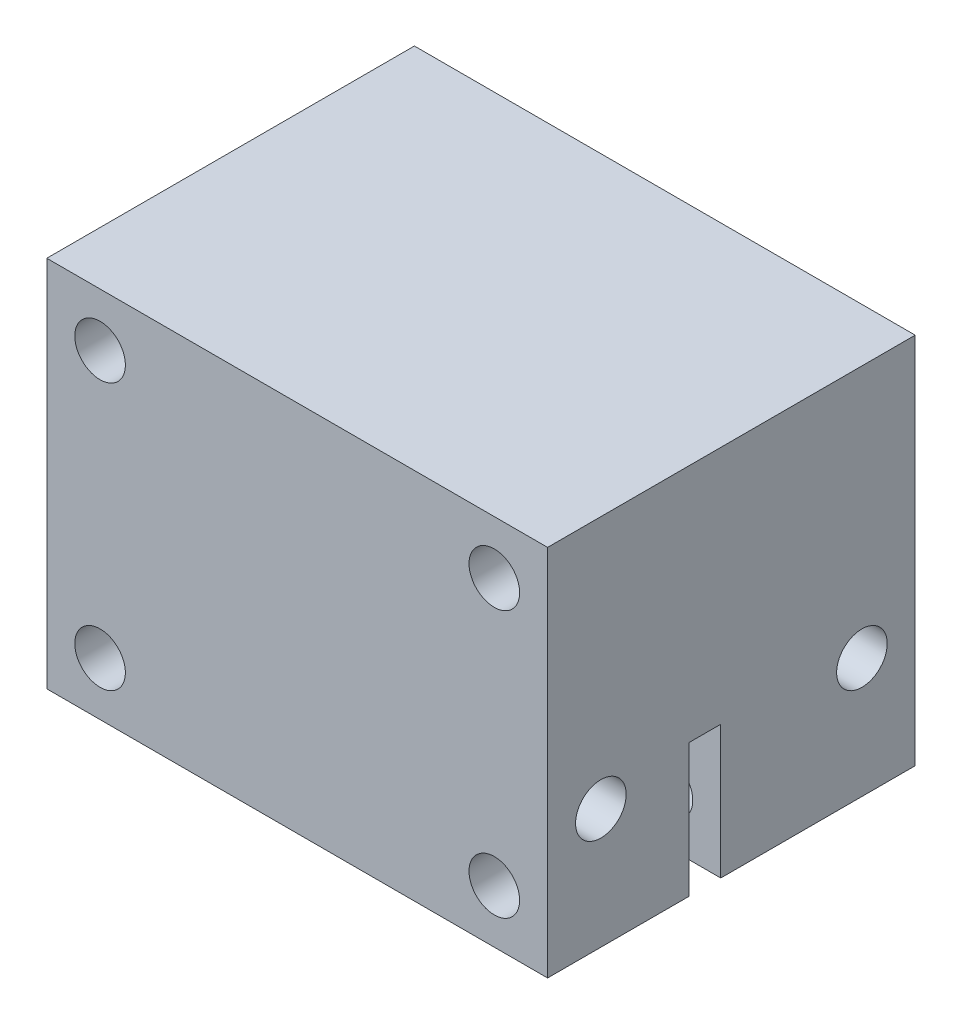
ISO-10303-21;
HEADER;
FILE_DESCRIPTION(('STEP AP214'),'2;1');
FILE_NAME('part.step','',(''),(''),'','','');
FILE_SCHEMA(('AUTOMOTIVE_DESIGN { 1 0 10303 214 1 1 1 1 }'));
ENDSEC;
DATA;
#1=APPLICATION_CONTEXT('core data for automotive mechanical design processes');
#2=APPLICATION_PROTOCOL_DEFINITION('international standard','automotive_design',2000,#1);
#3=PRODUCT_CONTEXT('',#1,'mechanical');
#4=PRODUCT('Part','Part','',(#3));
#5=PRODUCT_RELATED_PRODUCT_CATEGORY('part','',(#4));
#6=PRODUCT_DEFINITION_FORMATION('','',#4);
#7=PRODUCT_DEFINITION_CONTEXT('part definition',#1,'design');
#8=PRODUCT_DEFINITION('design','',#6,#7);
#9=PRODUCT_DEFINITION_SHAPE('','',#8);
#10=(LENGTH_UNIT() NAMED_UNIT(*) SI_UNIT(.MILLI.,.METRE.));
#11=(NAMED_UNIT(*) PLANE_ANGLE_UNIT() SI_UNIT($,.RADIAN.));
#12=(NAMED_UNIT(*) SI_UNIT($,.STERADIAN.) SOLID_ANGLE_UNIT());
#13=UNCERTAINTY_MEASURE_WITH_UNIT(LENGTH_MEASURE(1.E-05),#10,'distance_accuracy_value','');
#14=(GEOMETRIC_REPRESENTATION_CONTEXT(3) GLOBAL_UNCERTAINTY_ASSIGNED_CONTEXT((#13)) GLOBAL_UNIT_ASSIGNED_CONTEXT((#10,
#11,#12)) REPRESENTATION_CONTEXT('',''));
#15=CARTESIAN_POINT('',(0.,0.,0.));
#16=DIRECTION('',(0.,0.,1.));
#17=DIRECTION('',(1.,0.,0.));
#18=AXIS2_PLACEMENT_3D('',#15,#16,#17);
#19=CARTESIAN_POINT('',(0.,0.,27.6));
#20=DIRECTION('',(0.,1.,0.));
#21=DIRECTION('',(-1.,0.,0.));
#22=AXIS2_PLACEMENT_3D('',#19,#20,#21);
#23=PLANE('',#22);
#24=DIRECTION('',(0.,0.,-1.));
#25=VECTOR('',#24,1.);
#26=CARTESIAN_POINT('',(0.,0.,27.6));
#27=LINE('',#26,#25);
#28=CARTESIAN_POINT('',(0.,0.,27.6));
#29=VERTEX_POINT('',#28);
#30=CARTESIAN_POINT('',(0.,0.,17.));
#31=VERTEX_POINT('',#30);
#32=EDGE_CURVE('E11',#29,#31,#27,.T.);
#33=ORIENTED_EDGE('',*,*,#32,.T.);
#34=DIRECTION('',(1.,0.,0.));
#35=VECTOR('',#34,1.);
#36=CARTESIAN_POINT('',(0.,0.,17.));
#37=LINE('',#36,#35);
#38=CARTESIAN_POINT('',(37.6,0.,17.));
#39=VERTEX_POINT('',#38);
#40=EDGE_CURVE('E116',#31,#39,#37,.T.);
#41=ORIENTED_EDGE('',*,*,#40,.T.);
#42=DIRECTION('',(0.,0.,-1.));
#43=VECTOR('',#42,1.);
#44=CARTESIAN_POINT('',(37.6,0.,27.6));
#45=LINE('',#44,#43);
#46=CARTESIAN_POINT('',(37.6,0.,27.6));
#47=VERTEX_POINT('',#46);
#48=EDGE_CURVE('E165',#47,#39,#45,.T.);
#49=ORIENTED_EDGE('',*,*,#48,.F.);
#50=DIRECTION('',(1.,0.,0.));
#51=VECTOR('',#50,1.);
#52=CARTESIAN_POINT('',(0.,0.,27.6));
#53=LINE('',#52,#51);
#54=EDGE_CURVE('E93',#29,#47,#53,.T.);
#55=ORIENTED_EDGE('',*,*,#54,.F.);
#56=EDGE_LOOP('',(#33,#41,#49,#55));
#57=FACE_BOUND('',#56,.T.);
#58=ADVANCED_FACE('F39',(#57),#23,.F.);
#59=CARTESIAN_POINT('',(33.6,4.,27.6));
#60=DIRECTION('',(0.,0.,-1.));
#61=DIRECTION('',(-1.,0.,0.));
#62=AXIS2_PLACEMENT_3D('',#59,#60,#61);
#63=CYLINDRICAL_SURFACE('',#62,1.9);
#64=CARTESIAN_POINT('',(33.6,4.,17.));
#65=DIRECTION('',(0.,0.,1.));
#66=DIRECTION('',(1.,0.,0.));
#67=AXIS2_PLACEMENT_3D('',#64,#65,#66);
#68=CIRCLE('',#67,1.9);
#69=CARTESIAN_POINT('',(31.7,4.,17.));
#70=VERTEX_POINT('',#69);
#71=EDGE_CURVE('E204',#70,#70,#68,.T.);
#72=CARTESIAN_POINT('',(33.6,4.,27.6));
#73=DIRECTION('',(0.,0.,1.));
#74=DIRECTION('',(1.,0.,0.));
#75=AXIS2_PLACEMENT_3D('',#72,#73,#74);
#76=CIRCLE('',#75,1.9);
#77=CARTESIAN_POINT('',(31.7,4.,27.6));
#78=VERTEX_POINT('',#77);
#79=EDGE_CURVE('E214',#78,#78,#76,.T.);
#80=CARTESIAN_POINT('',(31.7,4.,17.));
#81=CARTESIAN_POINT('',(31.7,4.,17.1104166666667));
#82=CARTESIAN_POINT('',(31.7,4.,17.2208333333333));
#83=CARTESIAN_POINT('',(31.7,4.,17.4416666666667));
#84=CARTESIAN_POINT('',(31.7,4.,17.5520833333333));
#85=CARTESIAN_POINT('',(31.7,4.,17.7729166666667));
#86=CARTESIAN_POINT('',(31.7,4.,17.8833333333333));
#87=CARTESIAN_POINT('',(31.7,4.,18.1041666666667));
#88=CARTESIAN_POINT('',(31.7,4.,18.2145833333333));
#89=CARTESIAN_POINT('',(31.7,4.,18.4354166666667));
#90=CARTESIAN_POINT('',(31.7,4.,18.5458333333333));
#91=CARTESIAN_POINT('',(31.7,4.,18.7666666666667));
#92=CARTESIAN_POINT('',(31.7,4.,18.8770833333333));
#93=CARTESIAN_POINT('',(31.7,4.,19.0979166666667));
#94=CARTESIAN_POINT('',(31.7,4.,19.2083333333333));
#95=CARTESIAN_POINT('',(31.7,4.,19.4291666666667));
#96=CARTESIAN_POINT('',(31.7,4.,19.5395833333333));
#97=CARTESIAN_POINT('',(31.7,4.,19.7604166666667));
#98=CARTESIAN_POINT('',(31.7,4.,19.8708333333333));
#99=CARTESIAN_POINT('',(31.7,4.,20.0916666666667));
#100=CARTESIAN_POINT('',(31.7,4.,20.2020833333333));
#101=CARTESIAN_POINT('',(31.7,4.,20.4229166666667));
#102=CARTESIAN_POINT('',(31.7,4.,20.5333333333333));
#103=CARTESIAN_POINT('',(31.7,4.,20.7541666666667));
#104=CARTESIAN_POINT('',(31.7,4.,20.8645833333333));
#105=CARTESIAN_POINT('',(31.7,4.,21.0854166666667));
#106=CARTESIAN_POINT('',(31.7,4.,21.1958333333333));
#107=CARTESIAN_POINT('',(31.7,4.,21.4166666666667));
#108=CARTESIAN_POINT('',(31.7,4.,21.5270833333333));
#109=CARTESIAN_POINT('',(31.7,4.,21.7479166666667));
#110=CARTESIAN_POINT('',(31.7,4.,21.8583333333333));
#111=CARTESIAN_POINT('',(31.7,4.,22.0791666666667));
#112=CARTESIAN_POINT('',(31.7,4.,22.1895833333333));
#113=CARTESIAN_POINT('',(31.7,4.,22.4104166666667));
#114=CARTESIAN_POINT('',(31.7,4.,22.5208333333333));
#115=CARTESIAN_POINT('',(31.7,4.,22.7416666666667));
#116=CARTESIAN_POINT('',(31.7,4.,22.8520833333333));
#117=CARTESIAN_POINT('',(31.7,4.,23.0729166666667));
#118=CARTESIAN_POINT('',(31.7,4.,23.1833333333333));
#119=CARTESIAN_POINT('',(31.7,4.,23.4041666666667));
#120=CARTESIAN_POINT('',(31.7,4.,23.5145833333333));
#121=CARTESIAN_POINT('',(31.7,4.,23.7354166666667));
#122=CARTESIAN_POINT('',(31.7,4.,23.8458333333333));
#123=CARTESIAN_POINT('',(31.7,4.,24.0666666666667));
#124=CARTESIAN_POINT('',(31.7,4.,24.1770833333333));
#125=CARTESIAN_POINT('',(31.7,4.,24.3979166666667));
#126=CARTESIAN_POINT('',(31.7,4.,24.5083333333333));
#127=CARTESIAN_POINT('',(31.7,4.,24.7291666666667));
#128=CARTESIAN_POINT('',(31.7,4.,24.8395833333333));
#129=CARTESIAN_POINT('',(31.7,4.,25.0604166666667));
#130=CARTESIAN_POINT('',(31.7,4.,25.1708333333333));
#131=CARTESIAN_POINT('',(31.7,4.,25.3916666666667));
#132=CARTESIAN_POINT('',(31.7,4.,25.5020833333333));
#133=CARTESIAN_POINT('',(31.7,4.,25.7229166666667));
#134=CARTESIAN_POINT('',(31.7,4.,25.8333333333333));
#135=CARTESIAN_POINT('',(31.7,4.,26.0541666666667));
#136=CARTESIAN_POINT('',(31.7,4.,26.1645833333333));
#137=CARTESIAN_POINT('',(31.7,4.,26.3854166666667));
#138=CARTESIAN_POINT('',(31.7,4.,26.4958333333333));
#139=CARTESIAN_POINT('',(31.7,4.,26.7166666666667));
#140=CARTESIAN_POINT('',(31.7,4.,26.8270833333333));
#141=CARTESIAN_POINT('',(31.7,4.,27.0479166666667));
#142=CARTESIAN_POINT('',(31.7,4.,27.1583333333333));
#143=CARTESIAN_POINT('',(31.7,4.,27.3791666666667));
#144=CARTESIAN_POINT('',(31.7,4.,27.4895833333333));
#145=CARTESIAN_POINT('',(31.7,4.,27.6));
#146=B_SPLINE_CURVE_WITH_KNOTS('',3,(#80,#81,#82,#83,#84,#85,#86,#87,#88,#89,#90,#91,#92,#93,
#94,#95,#96,#97,#98,#99,#100,#101,#102,#103,#104,#105,#106,#107,#108,#109,#110,#111,#112,#113,
#114,#115,#116,#117,#118,#119,#120,#121,#122,#123,#124,#125,#126,#127,#128,#129,#130,#131,#132,
#133,#134,#135,#136,#137,#138,#139,#140,#141,#142,#143,#144,#145),.UNSPECIFIED.,.F.,.F.,(4,2,2,
2,2,2,2,2,2,2,2,2,2,2,2,2,2,2,2,2,2,2,2,2,2,2,2,2,2,2,2,2,4),(0.,0.331249999999998,
0.662499999999996,0.993749999999998,1.325,1.65625,1.9875,2.31875,2.65,2.98125,3.3125,3.64375,
3.975,4.30625,4.6375,4.96875,5.3,5.63125,5.9625,6.29375,6.625,6.95625,7.2875,7.61875,7.95,
8.28125,8.6125,8.94375,9.275,9.60625,9.9375,10.26875,10.6),.UNSPECIFIED.);
#147=EDGE_CURVE('BSEAM135',#70,#78,#146,.T.);
#148=ORIENTED_EDGE('',*,*,#71,.F.);
#149=ORIENTED_EDGE('',*,*,#79,.T.);
#150=ORIENTED_EDGE('',*,*,#147,.T.);
#151=ORIENTED_EDGE('',*,*,#147,.F.);
#152=EDGE_LOOP('',(#148,#150,#149,#151));
#153=FACE_BOUND('',#152,.T.);
#154=ADVANCED_FACE('F135',(#153),#63,.F.);
#155=CARTESIAN_POINT('',(3.99999999999998,4.,27.6));
#156=DIRECTION('',(0.,0.,-1.));
#157=DIRECTION('',(-1.,0.,0.));
#158=AXIS2_PLACEMENT_3D('',#155,#156,#157);
#159=CYLINDRICAL_SURFACE('',#158,1.9);
#160=CARTESIAN_POINT('',(3.99999999999998,4.,17.));
#161=DIRECTION('',(0.,0.,1.));
#162=DIRECTION('',(1.,0.,0.));
#163=AXIS2_PLACEMENT_3D('',#160,#161,#162);
#164=CIRCLE('',#163,1.9);
#165=CARTESIAN_POINT('',(2.09999999999998,4.,17.));
#166=VERTEX_POINT('',#165);
#167=EDGE_CURVE('E43',#166,#166,#164,.T.);
#168=CARTESIAN_POINT('',(3.99999999999998,4.,27.6));
#169=DIRECTION('',(0.,0.,1.));
#170=DIRECTION('',(1.,0.,0.));
#171=AXIS2_PLACEMENT_3D('',#168,#169,#170);
#172=CIRCLE('',#171,1.9);
#173=CARTESIAN_POINT('',(2.09999999999998,4.,27.6));
#174=VERTEX_POINT('',#173);
#175=EDGE_CURVE('E208',#174,#174,#172,.T.);
#176=CARTESIAN_POINT('',(2.09999999999998,4.,17.));
#177=CARTESIAN_POINT('',(2.09999999999998,4.,17.1104166666667));
#178=CARTESIAN_POINT('',(2.09999999999998,4.,17.2208333333333));
#179=CARTESIAN_POINT('',(2.09999999999998,4.,17.4416666666667));
#180=CARTESIAN_POINT('',(2.09999999999998,4.,17.5520833333333));
#181=CARTESIAN_POINT('',(2.09999999999998,4.,17.7729166666667));
#182=CARTESIAN_POINT('',(2.09999999999998,4.,17.8833333333333));
#183=CARTESIAN_POINT('',(2.09999999999998,4.,18.1041666666667));
#184=CARTESIAN_POINT('',(2.09999999999998,4.,18.2145833333333));
#185=CARTESIAN_POINT('',(2.09999999999998,4.,18.4354166666667));
#186=CARTESIAN_POINT('',(2.09999999999998,4.,18.5458333333333));
#187=CARTESIAN_POINT('',(2.09999999999998,4.,18.7666666666667));
#188=CARTESIAN_POINT('',(2.09999999999998,4.,18.8770833333333));
#189=CARTESIAN_POINT('',(2.09999999999998,4.,19.0979166666667));
#190=CARTESIAN_POINT('',(2.09999999999998,4.,19.2083333333333));
#191=CARTESIAN_POINT('',(2.09999999999998,4.,19.4291666666667));
#192=CARTESIAN_POINT('',(2.09999999999998,4.,19.5395833333333));
#193=CARTESIAN_POINT('',(2.09999999999998,4.,19.7604166666667));
#194=CARTESIAN_POINT('',(2.09999999999998,4.,19.8708333333333));
#195=CARTESIAN_POINT('',(2.09999999999998,4.,20.0916666666667));
#196=CARTESIAN_POINT('',(2.09999999999998,4.,20.2020833333333));
#197=CARTESIAN_POINT('',(2.09999999999998,4.,20.4229166666667));
#198=CARTESIAN_POINT('',(2.09999999999998,4.,20.5333333333333));
#199=CARTESIAN_POINT('',(2.09999999999998,4.,20.7541666666667));
#200=CARTESIAN_POINT('',(2.09999999999998,4.,20.8645833333333));
#201=CARTESIAN_POINT('',(2.09999999999998,4.,21.0854166666667));
#202=CARTESIAN_POINT('',(2.09999999999998,4.,21.1958333333333));
#203=CARTESIAN_POINT('',(2.09999999999998,4.,21.4166666666667));
#204=CARTESIAN_POINT('',(2.09999999999998,4.,21.5270833333333));
#205=CARTESIAN_POINT('',(2.09999999999998,4.,21.7479166666667));
#206=CARTESIAN_POINT('',(2.09999999999998,4.,21.8583333333333));
#207=CARTESIAN_POINT('',(2.09999999999998,4.,22.0791666666667));
#208=CARTESIAN_POINT('',(2.09999999999998,4.,22.1895833333333));
#209=CARTESIAN_POINT('',(2.09999999999998,4.,22.4104166666667));
#210=CARTESIAN_POINT('',(2.09999999999998,4.,22.5208333333333));
#211=CARTESIAN_POINT('',(2.09999999999998,4.,22.7416666666667));
#212=CARTESIAN_POINT('',(2.09999999999998,4.,22.8520833333333));
#213=CARTESIAN_POINT('',(2.09999999999998,4.,23.0729166666667));
#214=CARTESIAN_POINT('',(2.09999999999998,4.,23.1833333333333));
#215=CARTESIAN_POINT('',(2.09999999999998,4.,23.4041666666667));
#216=CARTESIAN_POINT('',(2.09999999999998,4.,23.5145833333333));
#217=CARTESIAN_POINT('',(2.09999999999998,4.,23.7354166666667));
#218=CARTESIAN_POINT('',(2.09999999999998,4.,23.8458333333333));
#219=CARTESIAN_POINT('',(2.09999999999998,4.,24.0666666666667));
#220=CARTESIAN_POINT('',(2.09999999999998,4.,24.1770833333333));
#221=CARTESIAN_POINT('',(2.09999999999998,4.,24.3979166666667));
#222=CARTESIAN_POINT('',(2.09999999999998,4.,24.5083333333333));
#223=CARTESIAN_POINT('',(2.09999999999998,4.,24.7291666666667));
#224=CARTESIAN_POINT('',(2.09999999999998,4.,24.8395833333333));
#225=CARTESIAN_POINT('',(2.09999999999998,4.,25.0604166666667));
#226=CARTESIAN_POINT('',(2.09999999999998,4.,25.1708333333333));
#227=CARTESIAN_POINT('',(2.09999999999998,4.,25.3916666666667));
#228=CARTESIAN_POINT('',(2.09999999999998,4.,25.5020833333333));
#229=CARTESIAN_POINT('',(2.09999999999998,4.,25.7229166666667));
#230=CARTESIAN_POINT('',(2.09999999999998,4.,25.8333333333333));
#231=CARTESIAN_POINT('',(2.09999999999998,4.,26.0541666666667));
#232=CARTESIAN_POINT('',(2.09999999999998,4.,26.1645833333333));
#233=CARTESIAN_POINT('',(2.09999999999998,4.,26.3854166666667));
#234=CARTESIAN_POINT('',(2.09999999999998,4.,26.4958333333333));
#235=CARTESIAN_POINT('',(2.09999999999998,4.,26.7166666666667));
#236=CARTESIAN_POINT('',(2.09999999999998,4.,26.8270833333333));
#237=CARTESIAN_POINT('',(2.09999999999998,4.,27.0479166666667));
#238=CARTESIAN_POINT('',(2.09999999999998,4.,27.1583333333333));
#239=CARTESIAN_POINT('',(2.09999999999998,4.,27.3791666666667));
#240=CARTESIAN_POINT('',(2.09999999999998,4.,27.4895833333333));
#241=CARTESIAN_POINT('',(2.09999999999998,4.,27.6));
#242=B_SPLINE_CURVE_WITH_KNOTS('',3,(#176,#177,#178,#179,#180,#181,#182,#183,#184,#185,#186,
#187,#188,#189,#190,#191,#192,#193,#194,#195,#196,#197,#198,#199,#200,#201,#202,#203,#204,#205,
#206,#207,#208,#209,#210,#211,#212,#213,#214,#215,#216,#217,#218,#219,#220,#221,#222,#223,#224,
#225,#226,#227,#228,#229,#230,#231,#232,#233,#234,#235,#236,#237,#238,#239,#240,#241),
.UNSPECIFIED.,.F.,.F.,(4,2,2,2,2,2,2,2,2,2,2,2,2,2,2,2,2,2,2,2,2,2,2,2,2,2,2,2,2,2,2,2,4),(0.,
0.331249999999998,0.662499999999996,0.993749999999998,1.325,1.65625,1.9875,2.31875,2.65,2.98125,
3.3125,3.64375,3.975,4.30625,4.6375,4.96875,5.3,5.63125,5.9625,6.29375,6.625,6.95625,7.2875,
7.61875,7.95,8.28125,8.6125,8.94375,9.275,9.60625,9.9375,10.26875,10.6),.UNSPECIFIED.);
#243=EDGE_CURVE('BSEAM141',#166,#174,#242,.T.);
#244=ORIENTED_EDGE('',*,*,#167,.F.);
#245=ORIENTED_EDGE('',*,*,#175,.T.);
#246=ORIENTED_EDGE('',*,*,#243,.T.);
#247=ORIENTED_EDGE('',*,*,#243,.F.);
#248=EDGE_LOOP('',(#244,#246,#245,#247));
#249=FACE_BOUND('',#248,.T.);
#250=ADVANCED_FACE('F141',(#249),#159,.F.);
#251=CARTESIAN_POINT('',(0.,0.,27.6));
#252=DIRECTION('',(0.,0.,-1.));
#253=DIRECTION('',(-1.,0.,0.));
#254=AXIS2_PLACEMENT_3D('',#251,#252,#253);
#255=PLANE('',#254);
#256=DIRECTION('',(0.,-1.,0.));
#257=VECTOR('',#256,1.);
#258=CARTESIAN_POINT('',(0.,0.,27.6));
#259=LINE('',#258,#257);
#260=CARTESIAN_POINT('',(0.,28.,27.6));
#261=VERTEX_POINT('',#260);
#262=EDGE_CURVE('E232',#261,#29,#259,.T.);
#263=ORIENTED_EDGE('',*,*,#262,.T.);
#264=ORIENTED_EDGE('',*,*,#54,.T.);
#265=DIRECTION('',(0.,1.,0.));
#266=VECTOR('',#265,1.);
#267=CARTESIAN_POINT('',(37.6,0.,27.6));
#268=LINE('',#267,#266);
#269=CARTESIAN_POINT('',(37.6,28.,27.6));
#270=VERTEX_POINT('',#269);
#271=EDGE_CURVE('E235',#47,#270,#268,.T.);
#272=ORIENTED_EDGE('',*,*,#271,.T.);
#273=DIRECTION('',(-1.,0.,0.));
#274=VECTOR('',#273,1.);
#275=CARTESIAN_POINT('',(0.,28.,27.6));
#276=LINE('',#275,#274);
#277=EDGE_CURVE('E65',#270,#261,#276,.T.);
#278=ORIENTED_EDGE('',*,*,#277,.T.);
#279=EDGE_LOOP('',(#263,#264,#272,#278));
#280=FACE_BOUND('',#279,.T.);
#281=CARTESIAN_POINT('',(3.99999999999998,24.,27.6));
#282=DIRECTION('',(0.,0.,1.));
#283=DIRECTION('',(1.,0.,0.));
#284=AXIS2_PLACEMENT_3D('',#281,#282,#283);
#285=CIRCLE('',#284,1.9);
#286=CARTESIAN_POINT('',(2.09999999999998,24.,27.6));
#287=VERTEX_POINT('',#286);
#288=EDGE_CURVE('E226',#287,#287,#285,.T.);
#289=ORIENTED_EDGE('',*,*,#288,.F.);
#290=EDGE_LOOP('',(#289));
#291=FACE_BOUND('',#290,.T.);
#292=CARTESIAN_POINT('',(33.6,24.,27.6));
#293=DIRECTION('',(0.,0.,1.));
#294=DIRECTION('',(1.,0.,0.));
#295=AXIS2_PLACEMENT_3D('',#292,#293,#294);
#296=CIRCLE('',#295,1.9);
#297=CARTESIAN_POINT('',(31.7,24.,27.6));
#298=VERTEX_POINT('',#297);
#299=EDGE_CURVE('E220',#298,#298,#296,.T.);
#300=ORIENTED_EDGE('',*,*,#299,.F.);
#301=EDGE_LOOP('',(#300));
#302=FACE_BOUND('',#301,.T.);
#303=ORIENTED_EDGE('',*,*,#79,.F.);
#304=EDGE_LOOP('',(#303));
#305=FACE_BOUND('',#304,.T.);
#306=ORIENTED_EDGE('',*,*,#175,.F.);
#307=EDGE_LOOP('',(#306));
#308=FACE_BOUND('',#307,.T.);
#309=ADVANCED_FACE('F260',(#280,#291,#302,#305,#308),#255,.F.);
#310=CARTESIAN_POINT('',(0.,0.,0.));
#311=DIRECTION('',(0.,0.,-1.));
#312=DIRECTION('',(-1.,0.,0.));
#313=AXIS2_PLACEMENT_3D('',#310,#311,#312);
#314=PLANE('',#313);
#315=CARTESIAN_POINT('',(33.6,4.,0.));
#316=DIRECTION('',(0.,0.,1.));
#317=DIRECTION('',(1.,0.,0.));
#318=AXIS2_PLACEMENT_3D('',#315,#316,#317);
#319=CIRCLE('',#318,1.9);
#320=CARTESIAN_POINT('',(31.7,4.,0.));
#321=VERTEX_POINT('',#320);
#322=EDGE_CURVE('E211',#321,#321,#319,.T.);
#323=ORIENTED_EDGE('',*,*,#322,.T.);
#324=EDGE_LOOP('',(#323));
#325=FACE_BOUND('',#324,.T.);
#326=CARTESIAN_POINT('',(3.99999999999998,24.,0.));
#327=DIRECTION('',(0.,0.,1.));
#328=DIRECTION('',(1.,0.,0.));
#329=AXIS2_PLACEMENT_3D('',#326,#327,#328);
#330=CIRCLE('',#329,1.9);
#331=CARTESIAN_POINT('',(2.09999999999998,24.,0.));
#332=VERTEX_POINT('',#331);
#333=EDGE_CURVE('E223',#332,#332,#330,.T.);
#334=ORIENTED_EDGE('',*,*,#333,.T.);
#335=EDGE_LOOP('',(#334));
#336=FACE_BOUND('',#335,.T.);
#337=DIRECTION('',(0.,-1.,0.));
#338=VECTOR('',#337,1.);
#339=CARTESIAN_POINT('',(0.,0.,0.));
#340=LINE('',#339,#338);
#341=CARTESIAN_POINT('',(0.,28.,0.));
#342=VERTEX_POINT('',#341);
#343=CARTESIAN_POINT('',(0.,0.,0.));
#344=VERTEX_POINT('',#343);
#345=EDGE_CURVE('E229',#342,#344,#340,.T.);
#346=ORIENTED_EDGE('',*,*,#345,.F.);
#347=DIRECTION('',(-1.,0.,0.));
#348=VECTOR('',#347,1.);
#349=CARTESIAN_POINT('',(0.,28.,0.));
#350=LINE('',#349,#348);
#351=CARTESIAN_POINT('',(37.6,28.,0.));
#352=VERTEX_POINT('',#351);
#353=EDGE_CURVE('E86',#352,#342,#350,.T.);
#354=ORIENTED_EDGE('',*,*,#353,.F.);
#355=DIRECTION('',(0.,1.,0.));
#356=VECTOR('',#355,1.);
#357=CARTESIAN_POINT('',(37.6,0.,0.));
#358=LINE('',#357,#356);
#359=CARTESIAN_POINT('',(37.6,0.,0.));
#360=VERTEX_POINT('',#359);
#361=EDGE_CURVE('E241',#360,#352,#358,.T.);
#362=ORIENTED_EDGE('',*,*,#361,.F.);
#363=DIRECTION('',(1.,0.,0.));
#364=VECTOR('',#363,1.);
#365=CARTESIAN_POINT('',(0.,0.,0.));
#366=LINE('',#365,#364);
#367=EDGE_CURVE('E162',#344,#360,#366,.T.);
#368=ORIENTED_EDGE('',*,*,#367,.F.);
#369=EDGE_LOOP('',(#346,#354,#362,#368));
#370=FACE_BOUND('',#369,.T.);
#371=CARTESIAN_POINT('',(33.6,24.,0.));
#372=DIRECTION('',(0.,0.,1.));
#373=DIRECTION('',(1.,0.,0.));
#374=AXIS2_PLACEMENT_3D('',#371,#372,#373);
#375=CIRCLE('',#374,1.9);
#376=CARTESIAN_POINT('',(31.7,24.,0.));
#377=VERTEX_POINT('',#376);
#378=EDGE_CURVE('E217',#377,#377,#375,.T.);
#379=ORIENTED_EDGE('',*,*,#378,.T.);
#380=EDGE_LOOP('',(#379));
#381=FACE_BOUND('',#380,.T.);
#382=CARTESIAN_POINT('',(3.99999999999998,4.,0.));
#383=DIRECTION('',(0.,0.,1.));
#384=DIRECTION('',(1.,0.,0.));
#385=AXIS2_PLACEMENT_3D('',#382,#383,#384);
#386=CIRCLE('',#385,1.9);
#387=CARTESIAN_POINT('',(2.09999999999998,4.,0.));
#388=VERTEX_POINT('',#387);
#389=EDGE_CURVE('E207',#388,#388,#386,.T.);
#390=ORIENTED_EDGE('',*,*,#389,.T.);
#391=EDGE_LOOP('',(#390));
#392=FACE_BOUND('',#391,.T.);
#393=ADVANCED_FACE('F155',(#325,#336,#370,#381,#392),#314,.T.);
#394=CARTESIAN_POINT('',(0.,0.,27.6));
#395=DIRECTION('',(1.,0.,0.));
#396=DIRECTION('',(0.,1.,0.));
#397=AXIS2_PLACEMENT_3D('',#394,#395,#396);
#398=PLANE('',#397);
#399=CARTESIAN_POINT('',(0.,9.,23.6));
#400=DIRECTION('',(1.,0.,0.));
#401=DIRECTION('',(0.,1.,0.));
#402=AXIS2_PLACEMENT_3D('',#399,#400,#401);
#403=CIRCLE('',#402,1.9);
#404=CARTESIAN_POINT('',(0.,10.9,23.6));
#405=VERTEX_POINT('',#404);
#406=EDGE_CURVE('E174',#405,#405,#403,.T.);
#407=ORIENTED_EDGE('',*,*,#406,.T.);
#408=EDGE_LOOP('',(#407));
#409=FACE_BOUND('',#408,.T.);
#410=CARTESIAN_POINT('',(0.,9.,4.));
#411=DIRECTION('',(1.,0.,0.));
#412=DIRECTION('',(0.,1.,0.));
#413=AXIS2_PLACEMENT_3D('',#410,#411,#412);
#414=CIRCLE('',#413,1.9);
#415=CARTESIAN_POINT('',(0.,10.9,4.));
#416=VERTEX_POINT('',#415);
#417=EDGE_CURVE('E184',#416,#416,#414,.T.);
#418=ORIENTED_EDGE('',*,*,#417,.T.);
#419=EDGE_LOOP('',(#418));
#420=FACE_BOUND('',#419,.T.);
#421=DIRECTION('',(0.,0.,1.));
#422=VECTOR('',#421,1.);
#423=CARTESIAN_POINT('',(0.,10.,17.));
#424=LINE('',#423,#422);
#425=CARTESIAN_POINT('',(0.,10.,14.6));
#426=VERTEX_POINT('',#425);
#427=CARTESIAN_POINT('',(0.,10.,17.));
#428=VERTEX_POINT('',#427);
#429=EDGE_CURVE('E124',#426,#428,#424,.T.);
#430=ORIENTED_EDGE('',*,*,#429,.T.);
#431=DIRECTION('',(0.,-1.,0.));
#432=VECTOR('',#431,1.);
#433=CARTESIAN_POINT('',(0.,0.,17.));
#434=LINE('',#433,#432);
#435=EDGE_CURVE('E119',#428,#31,#434,.T.);
#436=ORIENTED_EDGE('',*,*,#435,.T.);
#437=ORIENTED_EDGE('',*,*,#32,.F.);
#438=ORIENTED_EDGE('',*,*,#262,.F.);
#439=DIRECTION('',(0.,0.,-1.));
#440=VECTOR('',#439,1.);
#441=CARTESIAN_POINT('',(0.,28.,27.6));
#442=LINE('',#441,#440);
#443=EDGE_CURVE('E168',#261,#342,#442,.T.);
#444=ORIENTED_EDGE('',*,*,#443,.T.);
#445=ORIENTED_EDGE('',*,*,#345,.T.);
#446=CARTESIAN_POINT('',(0.,0.,14.6));
#447=VERTEX_POINT('',#446);
#448=EDGE_CURVE('E48',#447,#344,#27,.T.);
#449=ORIENTED_EDGE('',*,*,#448,.F.);
#450=DIRECTION('',(0.,1.,0.));
#451=VECTOR('',#450,1.);
#452=CARTESIAN_POINT('',(0.,0.,14.6));
#453=LINE('',#452,#451);
#454=EDGE_CURVE('E131',#447,#426,#453,.T.);
#455=ORIENTED_EDGE('',*,*,#454,.T.);
#456=EDGE_LOOP('',(#430,#436,#437,#438,#444,#445,#449,#455));
#457=FACE_BOUND('',#456,.T.);
#458=ADVANCED_FACE('F41',(#409,#420,#457),#398,.F.);
#459=CARTESIAN_POINT('',(37.6,0.,14.6));
#460=VERTEX_POINT('',#459);
#461=EDGE_CURVE('E159',#460,#360,#45,.T.);
#462=ORIENTED_EDGE('',*,*,#461,.F.);
#463=DIRECTION('',(1.,0.,0.));
#464=VECTOR('',#463,1.);
#465=CARTESIAN_POINT('',(0.,0.,14.6));
#466=LINE('',#465,#464);
#467=EDGE_CURVE('E56',#447,#460,#466,.T.);
#468=ORIENTED_EDGE('',*,*,#467,.F.);
#469=ORIENTED_EDGE('',*,*,#448,.T.);
#470=ORIENTED_EDGE('',*,*,#367,.T.);
#471=EDGE_LOOP('',(#462,#468,#469,#470));
#472=FACE_BOUND('',#471,.T.);
#473=ADVANCED_FACE('F136',(#472),#23,.F.);
#474=CARTESIAN_POINT('',(37.6,0.,27.6));
#475=DIRECTION('',(-1.,0.,0.));
#476=DIRECTION('',(0.,-1.,0.));
#477=AXIS2_PLACEMENT_3D('',#474,#475,#476);
#478=PLANE('',#477);
#479=CARTESIAN_POINT('',(37.6,9.00000000000001,23.6));
#480=DIRECTION('',(1.,0.,0.));
#481=DIRECTION('',(0.,1.,0.));
#482=AXIS2_PLACEMENT_3D('',#479,#480,#481);
#483=CIRCLE('',#482,1.9);
#484=CARTESIAN_POINT('',(37.6,10.9,23.6));
#485=VERTEX_POINT('',#484);
#486=EDGE_CURVE('E180',#485,#485,#483,.T.);
#487=ORIENTED_EDGE('',*,*,#486,.F.);
#488=EDGE_LOOP('',(#487));
#489=FACE_BOUND('',#488,.T.);
#490=CARTESIAN_POINT('',(37.6,9.00000000000001,4.));
#491=DIRECTION('',(1.,0.,0.));
#492=DIRECTION('',(0.,1.,0.));
#493=AXIS2_PLACEMENT_3D('',#490,#491,#492);
#494=CIRCLE('',#493,1.9);
#495=CARTESIAN_POINT('',(37.6,10.9,4.));
#496=VERTEX_POINT('',#495);
#497=EDGE_CURVE('E189',#496,#496,#494,.T.);
#498=ORIENTED_EDGE('',*,*,#497,.F.);
#499=EDGE_LOOP('',(#498));
#500=FACE_BOUND('',#499,.T.);
#501=ORIENTED_EDGE('',*,*,#48,.T.);
#502=DIRECTION('',(0.,-1.,0.));
#503=VECTOR('',#502,1.);
#504=CARTESIAN_POINT('',(37.6,0.,17.));
#505=LINE('',#504,#503);
#506=CARTESIAN_POINT('',(37.6,10.,17.));
#507=VERTEX_POINT('',#506);
#508=EDGE_CURVE('E122',#507,#39,#505,.T.);
#509=ORIENTED_EDGE('',*,*,#508,.F.);
#510=DIRECTION('',(0.,0.,1.));
#511=VECTOR('',#510,1.);
#512=CARTESIAN_POINT('',(37.6,10.,17.));
#513=LINE('',#512,#511);
#514=CARTESIAN_POINT('',(37.6,10.,14.6));
#515=VERTEX_POINT('',#514);
#516=EDGE_CURVE('E132',#515,#507,#513,.T.);
#517=ORIENTED_EDGE('',*,*,#516,.F.);
#518=DIRECTION('',(0.,1.,0.));
#519=VECTOR('',#518,1.);
#520=CARTESIAN_POINT('',(37.6,0.,14.6));
#521=LINE('',#520,#519);
#522=EDGE_CURVE('E196',#460,#515,#521,.T.);
#523=ORIENTED_EDGE('',*,*,#522,.F.);
#524=ORIENTED_EDGE('',*,*,#461,.T.);
#525=ORIENTED_EDGE('',*,*,#361,.T.);
#526=DIRECTION('',(0.,0.,-1.));
#527=VECTOR('',#526,1.);
#528=CARTESIAN_POINT('',(37.6,28.,27.6));
#529=LINE('',#528,#527);
#530=EDGE_CURVE('E166',#270,#352,#529,.T.);
#531=ORIENTED_EDGE('',*,*,#530,.F.);
#532=ORIENTED_EDGE('',*,*,#271,.F.);
#533=EDGE_LOOP('',(#501,#509,#517,#523,#524,#525,#531,#532));
#534=FACE_BOUND('',#533,.T.);
#535=ADVANCED_FACE('F147',(#489,#500,#534),#478,.F.);
#536=CARTESIAN_POINT('',(0.,28.,27.6));
#537=DIRECTION('',(0.,-1.,0.));
#538=DIRECTION('',(1.,0.,0.));
#539=AXIS2_PLACEMENT_3D('',#536,#537,#538);
#540=PLANE('',#539);
#541=ORIENTED_EDGE('',*,*,#353,.T.);
#542=ORIENTED_EDGE('',*,*,#443,.F.);
#543=ORIENTED_EDGE('',*,*,#277,.F.);
#544=ORIENTED_EDGE('',*,*,#530,.T.);
#545=EDGE_LOOP('',(#541,#542,#543,#544));
#546=FACE_BOUND('',#545,.T.);
#547=ADVANCED_FACE('F153',(#546),#540,.F.);
#548=CARTESIAN_POINT('',(3.99999999999998,24.,27.6));
#549=DIRECTION('',(0.,0.,-1.));
#550=DIRECTION('',(-1.,0.,0.));
#551=AXIS2_PLACEMENT_3D('',#548,#549,#550);
#552=CYLINDRICAL_SURFACE('',#551,1.9);
#553=CARTESIAN_POINT('',(2.09999999999998,24.,27.6));
#554=CARTESIAN_POINT('',(2.09999999999998,24.,27.3125));
#555=CARTESIAN_POINT('',(2.09999999999998,24.,27.025));
#556=CARTESIAN_POINT('',(2.09999999999998,24.,26.45));
#557=CARTESIAN_POINT('',(2.09999999999998,24.,26.1625));
#558=CARTESIAN_POINT('',(2.09999999999998,24.,25.5875));
#559=CARTESIAN_POINT('',(2.09999999999998,24.,25.3));
#560=CARTESIAN_POINT('',(2.09999999999998,24.,24.725));
#561=CARTESIAN_POINT('',(2.09999999999998,24.,24.4375));
#562=CARTESIAN_POINT('',(2.09999999999998,24.,23.8625));
#563=CARTESIAN_POINT('',(2.09999999999998,24.,23.575));
#564=CARTESIAN_POINT('',(2.09999999999998,24.,23.));
#565=CARTESIAN_POINT('',(2.09999999999998,24.,22.7125));
#566=CARTESIAN_POINT('',(2.09999999999998,24.,22.1375));
#567=CARTESIAN_POINT('',(2.09999999999998,24.,21.85));
#568=CARTESIAN_POINT('',(2.09999999999998,24.,21.275));
#569=CARTESIAN_POINT('',(2.09999999999998,24.,20.9875));
#570=CARTESIAN_POINT('',(2.09999999999998,24.,20.4125));
#571=CARTESIAN_POINT('',(2.09999999999998,24.,20.125));
#572=CARTESIAN_POINT('',(2.09999999999998,24.,19.55));
#573=CARTESIAN_POINT('',(2.09999999999998,24.,19.2625));
#574=CARTESIAN_POINT('',(2.09999999999998,24.,18.6875));
#575=CARTESIAN_POINT('',(2.09999999999998,24.,18.4));
#576=CARTESIAN_POINT('',(2.09999999999998,24.,17.825));
#577=CARTESIAN_POINT('',(2.09999999999998,24.,17.5375));
#578=CARTESIAN_POINT('',(2.09999999999998,24.,16.9625));
#579=CARTESIAN_POINT('',(2.09999999999998,24.,16.675));
#580=CARTESIAN_POINT('',(2.09999999999998,24.,16.1));
#581=CARTESIAN_POINT('',(2.09999999999998,24.,15.8125));
#582=CARTESIAN_POINT('',(2.09999999999998,24.,15.2375));
#583=CARTESIAN_POINT('',(2.09999999999998,24.,14.95));
#584=CARTESIAN_POINT('',(2.09999999999998,24.,14.375));
#585=CARTESIAN_POINT('',(2.09999999999998,24.,14.0875));
#586=CARTESIAN_POINT('',(2.09999999999998,24.,13.5125));
#587=CARTESIAN_POINT('',(2.09999999999998,24.,13.225));
#588=CARTESIAN_POINT('',(2.09999999999998,24.,12.65));
#589=CARTESIAN_POINT('',(2.09999999999998,24.,12.3625));
#590=CARTESIAN_POINT('',(2.09999999999998,24.,11.7875));
#591=CARTESIAN_POINT('',(2.09999999999998,24.,11.5));
#592=CARTESIAN_POINT('',(2.09999999999998,24.,10.925));
#593=CARTESIAN_POINT('',(2.09999999999998,24.,10.6375));
#594=CARTESIAN_POINT('',(2.09999999999998,24.,10.0625));
#595=CARTESIAN_POINT('',(2.09999999999998,24.,9.775));
#596=CARTESIAN_POINT('',(2.09999999999998,24.,9.2));
#597=CARTESIAN_POINT('',(2.09999999999998,24.,8.9125));
#598=CARTESIAN_POINT('',(2.09999999999998,24.,8.3375));
#599=CARTESIAN_POINT('',(2.09999999999998,24.,8.05));
#600=CARTESIAN_POINT('',(2.09999999999998,24.,7.475));
#601=CARTESIAN_POINT('',(2.09999999999998,24.,7.1875));
#602=CARTESIAN_POINT('',(2.09999999999998,24.,6.6125));
#603=CARTESIAN_POINT('',(2.09999999999998,24.,6.325));
#604=CARTESIAN_POINT('',(2.09999999999998,24.,5.75));
#605=CARTESIAN_POINT('',(2.09999999999998,24.,5.4625));
#606=CARTESIAN_POINT('',(2.09999999999998,24.,4.8875));
#607=CARTESIAN_POINT('',(2.09999999999998,24.,4.6));
#608=CARTESIAN_POINT('',(2.09999999999998,24.,4.025));
#609=CARTESIAN_POINT('',(2.09999999999998,24.,3.7375));
#610=CARTESIAN_POINT('',(2.09999999999998,24.,3.1625));
#611=CARTESIAN_POINT('',(2.09999999999998,24.,2.875));
#612=CARTESIAN_POINT('',(2.09999999999998,24.,2.3));
#613=CARTESIAN_POINT('',(2.09999999999998,24.,2.0125));
#614=CARTESIAN_POINT('',(2.09999999999998,24.,1.4375));
#615=CARTESIAN_POINT('',(2.09999999999998,24.,1.15));
#616=CARTESIAN_POINT('',(2.09999999999998,24.,0.574999999999999));
#617=CARTESIAN_POINT('',(2.09999999999998,24.,0.287499999999999));
#618=CARTESIAN_POINT('',(2.09999999999998,24.,0.));
#619=B_SPLINE_CURVE_WITH_KNOTS('',3,(#553,#554,#555,#556,#557,#558,#559,#560,#561,#562,#563,
#564,#565,#566,#567,#568,#569,#570,#571,#572,#573,#574,#575,#576,#577,#578,#579,#580,#581,#582,
#583,#584,#585,#586,#587,#588,#589,#590,#591,#592,#593,#594,#595,#596,#597,#598,#599,#600,#601,
#602,#603,#604,#605,#606,#607,#608,#609,#610,#611,#612,#613,#614,#615,#616,#617,#618),
.UNSPECIFIED.,.F.,.F.,(4,2,2,2,2,2,2,2,2,2,2,2,2,2,2,2,2,2,2,2,2,2,2,2,2,2,2,2,2,2,2,2,4),(0.,
0.862499999999999,1.725,2.5875,3.45,4.3125,5.175,6.0375,6.9,7.7625,8.625,9.4875,10.35,11.2125,
12.075,12.9375,13.8,14.6625,15.525,16.3875,17.25,18.1125,18.975,19.8375,20.7,21.5625,22.425,
23.2875,24.15,25.0125,25.875,26.7375,27.6),.UNSPECIFIED.);
#620=EDGE_CURVE('BSEAM249',#287,#332,#619,.T.);
#621=ORIENTED_EDGE('',*,*,#288,.T.);
#622=ORIENTED_EDGE('',*,*,#333,.F.);
#623=ORIENTED_EDGE('',*,*,#620,.T.);
#624=ORIENTED_EDGE('',*,*,#620,.F.);
#625=EDGE_LOOP('',(#621,#623,#622,#624));
#626=FACE_BOUND('',#625,.T.);
#627=ADVANCED_FACE('F249',(#626),#552,.F.);
#628=CARTESIAN_POINT('',(33.6,24.,27.6));
#629=DIRECTION('',(0.,0.,-1.));
#630=DIRECTION('',(-1.,0.,0.));
#631=AXIS2_PLACEMENT_3D('',#628,#629,#630);
#632=CYLINDRICAL_SURFACE('',#631,1.9);
#633=CARTESIAN_POINT('',(31.7,24.,27.6));
#634=CARTESIAN_POINT('',(31.7,24.,27.3125));
#635=CARTESIAN_POINT('',(31.7,24.,27.025));
#636=CARTESIAN_POINT('',(31.7,24.,26.45));
#637=CARTESIAN_POINT('',(31.7,24.,26.1625));
#638=CARTESIAN_POINT('',(31.7,24.,25.5875));
#639=CARTESIAN_POINT('',(31.7,24.,25.3));
#640=CARTESIAN_POINT('',(31.7,24.,24.725));
#641=CARTESIAN_POINT('',(31.7,24.,24.4375));
#642=CARTESIAN_POINT('',(31.7,24.,23.8625));
#643=CARTESIAN_POINT('',(31.7,24.,23.575));
#644=CARTESIAN_POINT('',(31.7,24.,23.));
#645=CARTESIAN_POINT('',(31.7,24.,22.7125));
#646=CARTESIAN_POINT('',(31.7,24.,22.1375));
#647=CARTESIAN_POINT('',(31.7,24.,21.85));
#648=CARTESIAN_POINT('',(31.7,24.,21.275));
#649=CARTESIAN_POINT('',(31.7,24.,20.9875));
#650=CARTESIAN_POINT('',(31.7,24.,20.4125));
#651=CARTESIAN_POINT('',(31.7,24.,20.125));
#652=CARTESIAN_POINT('',(31.7,24.,19.55));
#653=CARTESIAN_POINT('',(31.7,24.,19.2625));
#654=CARTESIAN_POINT('',(31.7,24.,18.6875));
#655=CARTESIAN_POINT('',(31.7,24.,18.4));
#656=CARTESIAN_POINT('',(31.7,24.,17.825));
#657=CARTESIAN_POINT('',(31.7,24.,17.5375));
#658=CARTESIAN_POINT('',(31.7,24.,16.9625));
#659=CARTESIAN_POINT('',(31.7,24.,16.675));
#660=CARTESIAN_POINT('',(31.7,24.,16.1));
#661=CARTESIAN_POINT('',(31.7,24.,15.8125));
#662=CARTESIAN_POINT('',(31.7,24.,15.2375));
#663=CARTESIAN_POINT('',(31.7,24.,14.95));
#664=CARTESIAN_POINT('',(31.7,24.,14.375));
#665=CARTESIAN_POINT('',(31.7,24.,14.0875));
#666=CARTESIAN_POINT('',(31.7,24.,13.5125));
#667=CARTESIAN_POINT('',(31.7,24.,13.225));
#668=CARTESIAN_POINT('',(31.7,24.,12.65));
#669=CARTESIAN_POINT('',(31.7,24.,12.3625));
#670=CARTESIAN_POINT('',(31.7,24.,11.7875));
#671=CARTESIAN_POINT('',(31.7,24.,11.5));
#672=CARTESIAN_POINT('',(31.7,24.,10.925));
#673=CARTESIAN_POINT('',(31.7,24.,10.6375));
#674=CARTESIAN_POINT('',(31.7,24.,10.0625));
#675=CARTESIAN_POINT('',(31.7,24.,9.775));
#676=CARTESIAN_POINT('',(31.7,24.,9.2));
#677=CARTESIAN_POINT('',(31.7,24.,8.9125));
#678=CARTESIAN_POINT('',(31.7,24.,8.3375));
#679=CARTESIAN_POINT('',(31.7,24.,8.05));
#680=CARTESIAN_POINT('',(31.7,24.,7.475));
#681=CARTESIAN_POINT('',(31.7,24.,7.1875));
#682=CARTESIAN_POINT('',(31.7,24.,6.6125));
#683=CARTESIAN_POINT('',(31.7,24.,6.325));
#684=CARTESIAN_POINT('',(31.7,24.,5.75));
#685=CARTESIAN_POINT('',(31.7,24.,5.4625));
#686=CARTESIAN_POINT('',(31.7,24.,4.8875));
#687=CARTESIAN_POINT('',(31.7,24.,4.6));
#688=CARTESIAN_POINT('',(31.7,24.,4.025));
#689=CARTESIAN_POINT('',(31.7,24.,3.7375));
#690=CARTESIAN_POINT('',(31.7,24.,3.1625));
#691=CARTESIAN_POINT('',(31.7,24.,2.875));
#692=CARTESIAN_POINT('',(31.7,24.,2.3));
#693=CARTESIAN_POINT('',(31.7,24.,2.0125));
#694=CARTESIAN_POINT('',(31.7,24.,1.4375));
#695=CARTESIAN_POINT('',(31.7,24.,1.15));
#696=CARTESIAN_POINT('',(31.7,24.,0.574999999999999));
#697=CARTESIAN_POINT('',(31.7,24.,0.287499999999999));
#698=CARTESIAN_POINT('',(31.7,24.,0.));
#699=B_SPLINE_CURVE_WITH_KNOTS('',3,(#633,#634,#635,#636,#637,#638,#639,#640,#641,#642,#643,
#644,#645,#646,#647,#648,#649,#650,#651,#652,#653,#654,#655,#656,#657,#658,#659,#660,#661,#662,
#663,#664,#665,#666,#667,#668,#669,#670,#671,#672,#673,#674,#675,#676,#677,#678,#679,#680,#681,
#682,#683,#684,#685,#686,#687,#688,#689,#690,#691,#692,#693,#694,#695,#696,#697,#698),
.UNSPECIFIED.,.F.,.F.,(4,2,2,2,2,2,2,2,2,2,2,2,2,2,2,2,2,2,2,2,2,2,2,2,2,2,2,2,2,2,2,2,4),(0.,
0.862499999999999,1.725,2.5875,3.45,4.3125,5.175,6.0375,6.9,7.7625,8.625,9.4875,10.35,11.2125,
12.075,12.9375,13.8,14.6625,15.525,16.3875,17.25,18.1125,18.975,19.8375,20.7,21.5625,22.425,
23.2875,24.15,25.0125,25.875,26.7375,27.6),.UNSPECIFIED.);
#700=EDGE_CURVE('BSEAM255',#298,#377,#699,.T.);
#701=ORIENTED_EDGE('',*,*,#299,.T.);
#702=ORIENTED_EDGE('',*,*,#378,.F.);
#703=ORIENTED_EDGE('',*,*,#700,.T.);
#704=ORIENTED_EDGE('',*,*,#700,.F.);
#705=EDGE_LOOP('',(#701,#703,#702,#704));
#706=FACE_BOUND('',#705,.T.);
#707=ADVANCED_FACE('F255',(#706),#632,.F.);
#708=CARTESIAN_POINT('',(33.6,4.,14.6));
#709=DIRECTION('',(0.,0.,-1.));
#710=DIRECTION('',(-1.,0.,0.));
#711=AXIS2_PLACEMENT_3D('',#708,#709,#710);
#712=CIRCLE('',#711,1.9);
#713=CARTESIAN_POINT('',(31.7,4.,14.6));
#714=VERTEX_POINT('',#713);
#715=EDGE_CURVE('E173',#714,#714,#712,.T.);
#716=CARTESIAN_POINT('',(31.7,4.,14.6));
#717=CARTESIAN_POINT('',(31.7,4.,14.4479166666667));
#718=CARTESIAN_POINT('',(31.7,4.,14.2958333333333));
#719=CARTESIAN_POINT('',(31.7,4.,13.9916666666667));
#720=CARTESIAN_POINT('',(31.7,4.,13.8395833333333));
#721=CARTESIAN_POINT('',(31.7,4.,13.5354166666667));
#722=CARTESIAN_POINT('',(31.7,4.,13.3833333333333));
#723=CARTESIAN_POINT('',(31.7,4.,13.0791666666667));
#724=CARTESIAN_POINT('',(31.7,4.,12.9270833333333));
#725=CARTESIAN_POINT('',(31.7,4.,12.6229166666667));
#726=CARTESIAN_POINT('',(31.7,4.,12.4708333333333));
#727=CARTESIAN_POINT('',(31.7,4.,12.1666666666667));
#728=CARTESIAN_POINT('',(31.7,4.,12.0145833333333));
#729=CARTESIAN_POINT('',(31.7,4.,11.7104166666667));
#730=CARTESIAN_POINT('',(31.7,4.,11.5583333333333));
#731=CARTESIAN_POINT('',(31.7,4.,11.2541666666667));
#732=CARTESIAN_POINT('',(31.7,4.,11.1020833333333));
#733=CARTESIAN_POINT('',(31.7,4.,10.7979166666667));
#734=CARTESIAN_POINT('',(31.7,4.,10.6458333333333));
#735=CARTESIAN_POINT('',(31.7,4.,10.3416666666667));
#736=CARTESIAN_POINT('',(31.7,4.,10.1895833333333));
#737=CARTESIAN_POINT('',(31.7,4.,9.88541666666667));
#738=CARTESIAN_POINT('',(31.7,4.,9.73333333333334));
#739=CARTESIAN_POINT('',(31.7,4.,9.42916666666667));
#740=CARTESIAN_POINT('',(31.7,4.,9.27708333333334));
#741=CARTESIAN_POINT('',(31.7,4.,8.97291666666667));
#742=CARTESIAN_POINT('',(31.7,4.,8.82083333333333));
#743=CARTESIAN_POINT('',(31.7,4.,8.51666666666667));
#744=CARTESIAN_POINT('',(31.7,4.,8.36458333333334));
#745=CARTESIAN_POINT('',(31.7,4.,8.06041666666667));
#746=CARTESIAN_POINT('',(31.7,4.,7.90833333333334));
#747=CARTESIAN_POINT('',(31.7,4.,7.60416666666667));
#748=CARTESIAN_POINT('',(31.7,4.,7.45208333333334));
#749=CARTESIAN_POINT('',(31.7,4.,7.14791666666667));
#750=CARTESIAN_POINT('',(31.7,4.,6.99583333333334));
#751=CARTESIAN_POINT('',(31.7,4.,6.69166666666667));
#752=CARTESIAN_POINT('',(31.7,4.,6.53958333333334));
#753=CARTESIAN_POINT('',(31.7,4.,6.23541666666667));
#754=CARTESIAN_POINT('',(31.7,4.,6.08333333333334));
#755=CARTESIAN_POINT('',(31.7,4.,5.77916666666667));
#756=CARTESIAN_POINT('',(31.7,4.,5.62708333333333));
#757=CARTESIAN_POINT('',(31.7,4.,5.32291666666667));
#758=CARTESIAN_POINT('',(31.7,4.,5.17083333333334));
#759=CARTESIAN_POINT('',(31.7,4.,4.86666666666667));
#760=CARTESIAN_POINT('',(31.7,4.,4.71458333333334));
#761=CARTESIAN_POINT('',(31.7,4.,4.41041666666667));
#762=CARTESIAN_POINT('',(31.7,4.,4.25833333333334));
#763=CARTESIAN_POINT('',(31.7,4.,3.95416666666667));
#764=CARTESIAN_POINT('',(31.7,4.,3.80208333333333));
#765=CARTESIAN_POINT('',(31.7,4.,3.49791666666667));
#766=CARTESIAN_POINT('',(31.7,4.,3.34583333333333));
#767=CARTESIAN_POINT('',(31.7,4.,3.04166666666667));
#768=CARTESIAN_POINT('',(31.7,4.,2.88958333333333));
#769=CARTESIAN_POINT('',(31.7,4.,2.58541666666667));
#770=CARTESIAN_POINT('',(31.7,4.,2.43333333333333));
#771=CARTESIAN_POINT('',(31.7,4.,2.12916666666667));
#772=CARTESIAN_POINT('',(31.7,4.,1.97708333333333));
#773=CARTESIAN_POINT('',(31.7,4.,1.67291666666667));
#774=CARTESIAN_POINT('',(31.7,4.,1.52083333333333));
#775=CARTESIAN_POINT('',(31.7,4.,1.21666666666667));
#776=CARTESIAN_POINT('',(31.7,4.,1.06458333333333));
#777=CARTESIAN_POINT('',(31.7,4.,0.760416666666666));
#778=CARTESIAN_POINT('',(31.7,4.,0.608333333333332));
#779=CARTESIAN_POINT('',(31.7,4.,0.304166666666665));
#780=CARTESIAN_POINT('',(31.7,4.,0.152083333333333));
#781=CARTESIAN_POINT('',(31.7,4.,0.));
#782=B_SPLINE_CURVE_WITH_KNOTS('',3,(#716,#717,#718,#719,#720,#721,#722,#723,#724,#725,#726,
#727,#728,#729,#730,#731,#732,#733,#734,#735,#736,#737,#738,#739,#740,#741,#742,#743,#744,#745,
#746,#747,#748,#749,#750,#751,#752,#753,#754,#755,#756,#757,#758,#759,#760,#761,#762,#763,#764,
#765,#766,#767,#768,#769,#770,#771,#772,#773,#774,#775,#776,#777,#778,#779,#780,#781),
.UNSPECIFIED.,.F.,.F.,(4,2,2,2,2,2,2,2,2,2,2,2,2,2,2,2,2,2,2,2,2,2,2,2,2,2,2,2,2,2,2,2,4),(0.,
0.45625,0.9125,1.36875,1.825,2.28125,2.7375,3.19375,3.65,4.10625,4.5625,5.01875,5.475,5.93125,
6.3875,6.84375,7.3,7.75625,8.2125,8.66875,9.125,9.58125,10.0375,10.49375,10.95,11.40625,11.8625,
12.31875,12.775,13.23125,13.6875,14.14375,14.6),.UNSPECIFIED.);
#783=EDGE_CURVE('BSEAM144',#714,#321,#782,.T.);
#784=ORIENTED_EDGE('',*,*,#715,.F.);
#785=ORIENTED_EDGE('',*,*,#322,.F.);
#786=ORIENTED_EDGE('',*,*,#783,.T.);
#787=ORIENTED_EDGE('',*,*,#783,.F.);
#788=EDGE_LOOP('',(#784,#786,#785,#787));
#789=FACE_BOUND('',#788,.T.);
#790=ADVANCED_FACE('F144',(#789),#63,.F.);
#791=CARTESIAN_POINT('',(3.99999999999998,4.,14.6));
#792=DIRECTION('',(0.,0.,-1.));
#793=DIRECTION('',(-1.,0.,0.));
#794=AXIS2_PLACEMENT_3D('',#791,#792,#793);
#795=CIRCLE('',#794,1.9);
#796=CARTESIAN_POINT('',(2.09999999999998,4.,14.6));
#797=VERTEX_POINT('',#796);
#798=EDGE_CURVE('E171',#797,#797,#795,.T.);
#799=CARTESIAN_POINT('',(2.09999999999998,4.,14.6));
#800=CARTESIAN_POINT('',(2.09999999999998,4.,14.4479166666667));
#801=CARTESIAN_POINT('',(2.09999999999998,4.,14.2958333333333));
#802=CARTESIAN_POINT('',(2.09999999999998,4.,13.9916666666667));
#803=CARTESIAN_POINT('',(2.09999999999998,4.,13.8395833333333));
#804=CARTESIAN_POINT('',(2.09999999999998,4.,13.5354166666667));
#805=CARTESIAN_POINT('',(2.09999999999998,4.,13.3833333333333));
#806=CARTESIAN_POINT('',(2.09999999999998,4.,13.0791666666667));
#807=CARTESIAN_POINT('',(2.09999999999998,4.,12.9270833333333));
#808=CARTESIAN_POINT('',(2.09999999999998,4.,12.6229166666667));
#809=CARTESIAN_POINT('',(2.09999999999998,4.,12.4708333333333));
#810=CARTESIAN_POINT('',(2.09999999999998,4.,12.1666666666667));
#811=CARTESIAN_POINT('',(2.09999999999998,4.,12.0145833333333));
#812=CARTESIAN_POINT('',(2.09999999999998,4.,11.7104166666667));
#813=CARTESIAN_POINT('',(2.09999999999998,4.,11.5583333333333));
#814=CARTESIAN_POINT('',(2.09999999999998,4.,11.2541666666667));
#815=CARTESIAN_POINT('',(2.09999999999998,4.,11.1020833333333));
#816=CARTESIAN_POINT('',(2.09999999999998,4.,10.7979166666667));
#817=CARTESIAN_POINT('',(2.09999999999998,4.,10.6458333333333));
#818=CARTESIAN_POINT('',(2.09999999999998,4.,10.3416666666667));
#819=CARTESIAN_POINT('',(2.09999999999998,4.,10.1895833333333));
#820=CARTESIAN_POINT('',(2.09999999999998,4.,9.88541666666667));
#821=CARTESIAN_POINT('',(2.09999999999998,4.,9.73333333333334));
#822=CARTESIAN_POINT('',(2.09999999999998,4.,9.42916666666667));
#823=CARTESIAN_POINT('',(2.09999999999998,4.,9.27708333333334));
#824=CARTESIAN_POINT('',(2.09999999999998,4.,8.97291666666667));
#825=CARTESIAN_POINT('',(2.09999999999998,4.,8.82083333333333));
#826=CARTESIAN_POINT('',(2.09999999999998,4.,8.51666666666667));
#827=CARTESIAN_POINT('',(2.09999999999998,4.,8.36458333333334));
#828=CARTESIAN_POINT('',(2.09999999999998,4.,8.06041666666667));
#829=CARTESIAN_POINT('',(2.09999999999998,4.,7.90833333333334));
#830=CARTESIAN_POINT('',(2.09999999999998,4.,7.60416666666667));
#831=CARTESIAN_POINT('',(2.09999999999998,4.,7.45208333333334));
#832=CARTESIAN_POINT('',(2.09999999999998,4.,7.14791666666667));
#833=CARTESIAN_POINT('',(2.09999999999998,4.,6.99583333333334));
#834=CARTESIAN_POINT('',(2.09999999999998,4.,6.69166666666667));
#835=CARTESIAN_POINT('',(2.09999999999998,4.,6.53958333333334));
#836=CARTESIAN_POINT('',(2.09999999999998,4.,6.23541666666667));
#837=CARTESIAN_POINT('',(2.09999999999998,4.,6.08333333333334));
#838=CARTESIAN_POINT('',(2.09999999999998,4.,5.77916666666667));
#839=CARTESIAN_POINT('',(2.09999999999998,4.,5.62708333333333));
#840=CARTESIAN_POINT('',(2.09999999999998,4.,5.32291666666667));
#841=CARTESIAN_POINT('',(2.09999999999998,4.,5.17083333333334));
#842=CARTESIAN_POINT('',(2.09999999999998,4.,4.86666666666667));
#843=CARTESIAN_POINT('',(2.09999999999998,4.,4.71458333333334));
#844=CARTESIAN_POINT('',(2.09999999999998,4.,4.41041666666667));
#845=CARTESIAN_POINT('',(2.09999999999998,4.,4.25833333333334));
#846=CARTESIAN_POINT('',(2.09999999999998,4.,3.95416666666667));
#847=CARTESIAN_POINT('',(2.09999999999998,4.,3.80208333333333));
#848=CARTESIAN_POINT('',(2.09999999999998,4.,3.49791666666667));
#849=CARTESIAN_POINT('',(2.09999999999998,4.,3.34583333333333));
#850=CARTESIAN_POINT('',(2.09999999999998,4.,3.04166666666667));
#851=CARTESIAN_POINT('',(2.09999999999998,4.,2.88958333333333));
#852=CARTESIAN_POINT('',(2.09999999999998,4.,2.58541666666667));
#853=CARTESIAN_POINT('',(2.09999999999998,4.,2.43333333333333));
#854=CARTESIAN_POINT('',(2.09999999999998,4.,2.12916666666667));
#855=CARTESIAN_POINT('',(2.09999999999998,4.,1.97708333333333));
#856=CARTESIAN_POINT('',(2.09999999999998,4.,1.67291666666667));
#857=CARTESIAN_POINT('',(2.09999999999998,4.,1.52083333333333));
#858=CARTESIAN_POINT('',(2.09999999999998,4.,1.21666666666667));
#859=CARTESIAN_POINT('',(2.09999999999998,4.,1.06458333333333));
#860=CARTESIAN_POINT('',(2.09999999999998,4.,0.760416666666666));
#861=CARTESIAN_POINT('',(2.09999999999998,4.,0.608333333333332));
#862=CARTESIAN_POINT('',(2.09999999999998,4.,0.304166666666665));
#863=CARTESIAN_POINT('',(2.09999999999998,4.,0.152083333333333));
#864=CARTESIAN_POINT('',(2.09999999999998,4.,0.));
#865=B_SPLINE_CURVE_WITH_KNOTS('',3,(#799,#800,#801,#802,#803,#804,#805,#806,#807,#808,#809,
#810,#811,#812,#813,#814,#815,#816,#817,#818,#819,#820,#821,#822,#823,#824,#825,#826,#827,#828,
#829,#830,#831,#832,#833,#834,#835,#836,#837,#838,#839,#840,#841,#842,#843,#844,#845,#846,#847,
#848,#849,#850,#851,#852,#853,#854,#855,#856,#857,#858,#859,#860,#861,#862,#863,#864),
.UNSPECIFIED.,.F.,.F.,(4,2,2,2,2,2,2,2,2,2,2,2,2,2,2,2,2,2,2,2,2,2,2,2,2,2,2,2,2,2,2,2,4),(0.,
0.45625,0.9125,1.36875,1.825,2.28125,2.7375,3.19375,3.65,4.10625,4.5625,5.01875,5.475,5.93125,
6.3875,6.84375,7.3,7.75625,8.2125,8.66875,9.125,9.58125,10.0375,10.49375,10.95,11.40625,11.8625,
12.31875,12.775,13.23125,13.6875,14.14375,14.6),.UNSPECIFIED.);
#866=EDGE_CURVE('BSEAM267',#797,#388,#865,.T.);
#867=ORIENTED_EDGE('',*,*,#798,.F.);
#868=ORIENTED_EDGE('',*,*,#389,.F.);
#869=ORIENTED_EDGE('',*,*,#866,.T.);
#870=ORIENTED_EDGE('',*,*,#866,.F.);
#871=EDGE_LOOP('',(#867,#869,#868,#870));
#872=FACE_BOUND('',#871,.T.);
#873=ADVANCED_FACE('F267',(#872),#159,.F.);
#874=CARTESIAN_POINT('',(0.,0.,17.));
#875=DIRECTION('',(0.,0.,1.));
#876=DIRECTION('',(1.,0.,0.));
#877=AXIS2_PLACEMENT_3D('',#874,#875,#876);
#878=PLANE('',#877);
#879=ORIENTED_EDGE('',*,*,#71,.T.);
#880=EDGE_LOOP('',(#879));
#881=FACE_BOUND('',#880,.T.);
#882=ORIENTED_EDGE('',*,*,#167,.T.);
#883=EDGE_LOOP('',(#882));
#884=FACE_BOUND('',#883,.T.);
#885=ORIENTED_EDGE('',*,*,#508,.T.);
#886=ORIENTED_EDGE('',*,*,#40,.F.);
#887=ORIENTED_EDGE('',*,*,#435,.F.);
#888=DIRECTION('',(1.,0.,0.));
#889=VECTOR('',#888,1.);
#890=CARTESIAN_POINT('',(0.,10.,17.));
#891=LINE('',#890,#889);
#892=EDGE_CURVE('E191',#428,#507,#891,.T.);
#893=ORIENTED_EDGE('',*,*,#892,.T.);
#894=EDGE_LOOP('',(#885,#886,#887,#893));
#895=FACE_BOUND('',#894,.T.);
#896=ADVANCED_FACE('F118',(#881,#884,#895),#878,.F.);
#897=CARTESIAN_POINT('',(0.,10.,17.));
#898=DIRECTION('',(0.,1.,0.));
#899=DIRECTION('',(-1.,0.,0.));
#900=AXIS2_PLACEMENT_3D('',#897,#898,#899);
#901=PLANE('',#900);
#902=ORIENTED_EDGE('',*,*,#516,.T.);
#903=ORIENTED_EDGE('',*,*,#892,.F.);
#904=ORIENTED_EDGE('',*,*,#429,.F.);
#905=DIRECTION('',(1.,0.,0.));
#906=VECTOR('',#905,1.);
#907=CARTESIAN_POINT('',(0.,10.,14.6));
#908=LINE('',#907,#906);
#909=EDGE_CURVE('E201',#426,#515,#908,.T.);
#910=ORIENTED_EDGE('',*,*,#909,.T.);
#911=EDGE_LOOP('',(#902,#903,#904,#910));
#912=FACE_BOUND('',#911,.T.);
#913=ADVANCED_FACE('F274',(#912),#901,.F.);
#914=CARTESIAN_POINT('',(0.,0.,14.6));
#915=DIRECTION('',(0.,0.,-1.));
#916=DIRECTION('',(-1.,0.,0.));
#917=AXIS2_PLACEMENT_3D('',#914,#915,#916);
#918=PLANE('',#917);
#919=ORIENTED_EDGE('',*,*,#715,.T.);
#920=EDGE_LOOP('',(#919));
#921=FACE_BOUND('',#920,.T.);
#922=ORIENTED_EDGE('',*,*,#798,.T.);
#923=EDGE_LOOP('',(#922));
#924=FACE_BOUND('',#923,.T.);
#925=ORIENTED_EDGE('',*,*,#522,.T.);
#926=ORIENTED_EDGE('',*,*,#909,.F.);
#927=ORIENTED_EDGE('',*,*,#454,.F.);
#928=ORIENTED_EDGE('',*,*,#467,.T.);
#929=EDGE_LOOP('',(#925,#926,#927,#928));
#930=FACE_BOUND('',#929,.T.);
#931=ADVANCED_FACE('F276',(#921,#924,#930),#918,.F.);
#932=CARTESIAN_POINT('',(0.,9.,4.));
#933=DIRECTION('',(1.,0.,0.));
#934=DIRECTION('',(0.,1.,0.));
#935=AXIS2_PLACEMENT_3D('',#932,#933,#934);
#936=CYLINDRICAL_SURFACE('',#935,1.9);
#937=ORIENTED_EDGE('',*,*,#417,.F.);
#938=EDGE_LOOP('',(#937));
#939=FACE_BOUND('',#938,.T.);
#940=ORIENTED_EDGE('',*,*,#497,.T.);
#941=EDGE_LOOP('',(#940));
#942=FACE_BOUND('',#941,.T.);
#943=ADVANCED_FACE('F279',(#939,#942),#936,.F.);
#944=CARTESIAN_POINT('',(0.,9.,23.6));
#945=DIRECTION('',(1.,0.,0.));
#946=DIRECTION('',(0.,1.,0.));
#947=AXIS2_PLACEMENT_3D('',#944,#945,#946);
#948=CYLINDRICAL_SURFACE('',#947,1.9);
#949=ORIENTED_EDGE('',*,*,#406,.F.);
#950=EDGE_LOOP('',(#949));
#951=FACE_BOUND('',#950,.T.);
#952=ORIENTED_EDGE('',*,*,#486,.T.);
#953=EDGE_LOOP('',(#952));
#954=FACE_BOUND('',#953,.T.);
#955=ADVANCED_FACE('F286',(#951,#954),#948,.F.);
#956=CLOSED_SHELL('',(#58,#154,#250,#309,#393,#458,#473,#535,#547,#627,#707,#790,#873,#896,#913,
#931,#943,#955));
#957=MANIFOLD_SOLID_BREP('B2',#956);
#958=ADVANCED_BREP_SHAPE_REPRESENTATION('',(#18,#957),#14);
#959=SHAPE_DEFINITION_REPRESENTATION(#9,#958);
ENDSEC;
END-ISO-10303-21;
